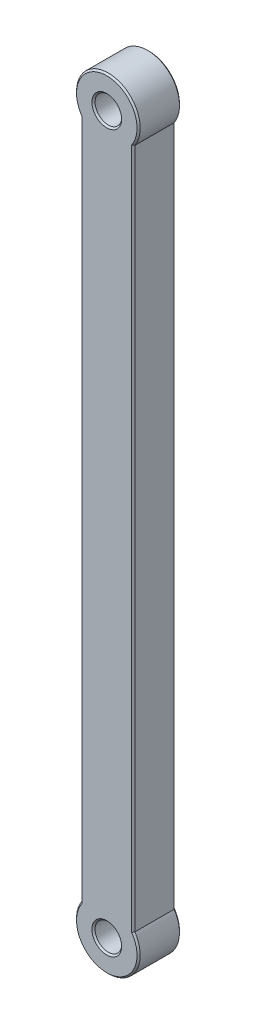
ISO-10303-21;
HEADER;
FILE_DESCRIPTION(('STEP AP214'),'2;1');
FILE_NAME('part.step','',(''),(''),'','','');
FILE_SCHEMA(('AUTOMOTIVE_DESIGN { 1 0 10303 214 1 1 1 1 }'));
ENDSEC;
DATA;
#1=APPLICATION_CONTEXT('core data for automotive mechanical design processes');
#2=APPLICATION_PROTOCOL_DEFINITION('international standard','automotive_design',2000,#1);
#3=PRODUCT_CONTEXT('',#1,'mechanical');
#4=PRODUCT('Part','Part','',(#3));
#5=PRODUCT_RELATED_PRODUCT_CATEGORY('part','',(#4));
#6=PRODUCT_DEFINITION_FORMATION('','',#4);
#7=PRODUCT_DEFINITION_CONTEXT('part definition',#1,'design');
#8=PRODUCT_DEFINITION('design','',#6,#7);
#9=PRODUCT_DEFINITION_SHAPE('','',#8);
#10=(LENGTH_UNIT() NAMED_UNIT(*) SI_UNIT(.MILLI.,.METRE.));
#11=(NAMED_UNIT(*) PLANE_ANGLE_UNIT() SI_UNIT($,.RADIAN.));
#12=(NAMED_UNIT(*) SI_UNIT($,.STERADIAN.) SOLID_ANGLE_UNIT());
#13=UNCERTAINTY_MEASURE_WITH_UNIT(LENGTH_MEASURE(1.E-05),#10,'distance_accuracy_value','');
#14=(GEOMETRIC_REPRESENTATION_CONTEXT(3) GLOBAL_UNCERTAINTY_ASSIGNED_CONTEXT((#13)) GLOBAL_UNIT_ASSIGNED_CONTEXT((#10,
#11,#12)) REPRESENTATION_CONTEXT('',''));
#15=CARTESIAN_POINT('',(0.,0.,0.));
#16=DIRECTION('',(0.,0.,1.));
#17=DIRECTION('',(1.,0.,0.));
#18=AXIS2_PLACEMENT_3D('',#15,#16,#17);
#19=CARTESIAN_POINT('',(5.,0.,8.));
#20=DIRECTION('',(-1.,0.,0.));
#21=DIRECTION('',(0.,0.,1.));
#22=AXIS2_PLACEMENT_3D('',#19,#20,#21);
#23=PLANE('',#22);
#24=DIRECTION('',(0.,0.,-1.));
#25=VECTOR('',#24,1.);
#26=CARTESIAN_POINT('',(5.,3.3166247903554,24.9705627484771));
#27=LINE('',#26,#25);
#28=CARTESIAN_POINT('',(5.,3.3166247903554,0.299999999999995));
#29=VERTEX_POINT('',#28);
#30=CARTESIAN_POINT('',(5.,3.3166247903554,7.69999999999999));
#31=VERTEX_POINT('',#30);
#32=EDGE_CURVE('E487',#29,#31,#27,.F.);
#33=ORIENTED_EDGE('',*,*,#32,.F.);
#34=DIRECTION('',(0.,1.,0.));
#35=VECTOR('',#34,1.);
#36=CARTESIAN_POINT('',(5.,0.,0.299999999999995));
#37=LINE('',#36,#35);
#38=CARTESIAN_POINT('',(5.,131.683375209645,0.299999999999995));
#39=VERTEX_POINT('',#38);
#40=EDGE_CURVE('E140',#29,#39,#37,.T.);
#41=ORIENTED_EDGE('',*,*,#40,.T.);
#42=DIRECTION('',(0.,0.,-1.));
#43=VECTOR('',#42,1.);
#44=CARTESIAN_POINT('',(5.,131.683375209645,24.9705627484771));
#45=LINE('',#44,#43);
#46=CARTESIAN_POINT('',(5.,131.683375209645,7.69999999999999));
#47=VERTEX_POINT('',#46);
#48=EDGE_CURVE('E124',#47,#39,#45,.T.);
#49=ORIENTED_EDGE('',*,*,#48,.F.);
#50=DIRECTION('',(0.,-1.,0.));
#51=VECTOR('',#50,1.);
#52=CARTESIAN_POINT('',(5.,3.3166247903554,7.69999999999998));
#53=LINE('',#52,#51);
#54=EDGE_CURVE('E137',#47,#31,#53,.T.);
#55=ORIENTED_EDGE('',*,*,#54,.T.);
#56=EDGE_LOOP('',(#33,#41,#49,#55));
#57=FACE_BOUND('',#56,.T.);
#58=ADVANCED_FACE('F46',(#57),#23,.F.);
#59=CARTESIAN_POINT('',(-5.,0.,8.));
#60=DIRECTION('',(1.,0.,0.));
#61=DIRECTION('',(0.,0.,-1.));
#62=AXIS2_PLACEMENT_3D('',#59,#60,#61);
#63=PLANE('',#62);
#64=DIRECTION('',(0.,0.,-1.));
#65=VECTOR('',#64,1.);
#66=CARTESIAN_POINT('',(-5.,131.683375209645,24.9705627484771));
#67=LINE('',#66,#65);
#68=CARTESIAN_POINT('',(-5.,131.683375209645,0.299999999999995));
#69=VERTEX_POINT('',#68);
#70=CARTESIAN_POINT('',(-5.,131.683375209645,7.69999999999999));
#71=VERTEX_POINT('',#70);
#72=EDGE_CURVE('E127',#69,#71,#67,.F.);
#73=ORIENTED_EDGE('',*,*,#72,.F.);
#74=DIRECTION('',(0.,-1.,0.));
#75=VECTOR('',#74,1.);
#76=CARTESIAN_POINT('',(-5.,0.,0.299999999999995));
#77=LINE('',#76,#75);
#78=CARTESIAN_POINT('',(-5.,3.3166247903554,0.299999999999995));
#79=VERTEX_POINT('',#78);
#80=EDGE_CURVE('E323',#69,#79,#77,.T.);
#81=ORIENTED_EDGE('',*,*,#80,.T.);
#82=DIRECTION('',(0.,0.,-1.));
#83=VECTOR('',#82,1.);
#84=CARTESIAN_POINT('',(-5.,3.3166247903554,24.9705627484771));
#85=LINE('',#84,#83);
#86=CARTESIAN_POINT('',(-5.,3.3166247903554,7.69999999999999));
#87=VERTEX_POINT('',#86);
#88=EDGE_CURVE('E207',#87,#79,#85,.T.);
#89=ORIENTED_EDGE('',*,*,#88,.F.);
#90=DIRECTION('',(0.,1.,0.));
#91=VECTOR('',#90,1.);
#92=CARTESIAN_POINT('',(-5.,131.683375209645,7.69999999999998));
#93=LINE('',#92,#91);
#94=EDGE_CURVE('E320',#87,#71,#93,.T.);
#95=ORIENTED_EDGE('',*,*,#94,.T.);
#96=EDGE_LOOP('',(#73,#81,#89,#95));
#97=FACE_BOUND('',#96,.T.);
#98=ADVANCED_FACE('F253',(#97),#63,.F.);
#99=CARTESIAN_POINT('',(0.,0.,8.));
#100=DIRECTION('',(0.,0.,1.));
#101=DIRECTION('',(1.,0.,0.));
#102=AXIS2_PLACEMENT_3D('',#99,#100,#101);
#103=PLANE('',#102);
#104=CARTESIAN_POINT('',(0.,135.,8.));
#105=DIRECTION('',(0.,0.,1.));
#106=DIRECTION('',(1.,0.,0.));
#107=AXIS2_PLACEMENT_3D('',#104,#105,#106);
#108=CIRCLE('',#107,5.70000000000001);
#109=CARTESIAN_POINT('',(4.7,131.775096900681,8.));
#110=VERTEX_POINT('',#109);
#111=CARTESIAN_POINT('',(-4.69999999999999,131.775096900681,8.));
#112=VERTEX_POINT('',#111);
#113=EDGE_CURVE('E63',#110,#112,#108,.T.);
#114=ORIENTED_EDGE('',*,*,#113,.T.);
#115=DIRECTION('',(0.,-1.,0.));
#116=VECTOR('',#115,1.);
#117=CARTESIAN_POINT('',(-4.7,3.3166247903554,8.));
#118=LINE('',#117,#116);
#119=CARTESIAN_POINT('',(-4.69999999999999,3.22490309931942,8.));
#120=VERTEX_POINT('',#119);
#121=EDGE_CURVE('E11',#112,#120,#118,.T.);
#122=ORIENTED_EDGE('',*,*,#121,.T.);
#123=CARTESIAN_POINT('',(0.,0.,8.));
#124=DIRECTION('',(0.,0.,1.));
#125=DIRECTION('',(1.,0.,0.));
#126=AXIS2_PLACEMENT_3D('',#123,#124,#125);
#127=CIRCLE('',#126,5.7);
#128=CARTESIAN_POINT('',(4.69999999999999,3.22490309931942,8.));
#129=VERTEX_POINT('',#128);
#130=EDGE_CURVE('E308',#120,#129,#127,.T.);
#131=ORIENTED_EDGE('',*,*,#130,.T.);
#132=DIRECTION('',(0.,1.,0.));
#133=VECTOR('',#132,1.);
#134=CARTESIAN_POINT('',(4.7,131.683375209645,8.));
#135=LINE('',#134,#133);
#136=EDGE_CURVE('E74',#129,#110,#135,.T.);
#137=ORIENTED_EDGE('',*,*,#136,.T.);
#138=EDGE_LOOP('',(#114,#122,#131,#137));
#139=FACE_BOUND('',#138,.T.);
#140=CARTESIAN_POINT('',(0.,0.,8.));
#141=DIRECTION('',(0.,0.,1.));
#142=DIRECTION('',(1.,0.,0.));
#143=AXIS2_PLACEMENT_3D('',#140,#141,#142);
#144=CIRCLE('',#143,2.79999999999998);
#145=CARTESIAN_POINT('',(2.79999999999998,0.,8.));
#146=VERTEX_POINT('',#145);
#147=EDGE_CURVE('E304',#146,#146,#144,.F.);
#148=ORIENTED_EDGE('',*,*,#147,.T.);
#149=EDGE_LOOP('',(#148));
#150=FACE_BOUND('',#149,.T.);
#151=CARTESIAN_POINT('',(-6.24500451351651E-13,135.000000000001,8.));
#152=DIRECTION('',(0.,0.,1.));
#153=DIRECTION('',(1.,0.,0.));
#154=AXIS2_PLACEMENT_3D('',#151,#152,#153);
#155=CIRCLE('',#154,2.80000000000001);
#156=CARTESIAN_POINT('',(2.79999999999939,135.000000000001,8.));
#157=VERTEX_POINT('',#156);
#158=EDGE_CURVE('E294',#157,#157,#155,.F.);
#159=ORIENTED_EDGE('',*,*,#158,.T.);
#160=EDGE_LOOP('',(#159));
#161=FACE_BOUND('',#160,.T.);
#162=ADVANCED_FACE('F256',(#139,#150,#161),#103,.T.);
#163=CARTESIAN_POINT('',(0.,0.,0.));
#164=DIRECTION('',(0.,0.,1.));
#165=DIRECTION('',(1.,0.,0.));
#166=AXIS2_PLACEMENT_3D('',#163,#164,#165);
#167=PLANE('',#166);
#168=DIRECTION('',(0.,1.,0.));
#169=VECTOR('',#168,1.);
#170=CARTESIAN_POINT('',(-4.70000000000001,0.,0.));
#171=LINE('',#170,#169);
#172=CARTESIAN_POINT('',(-4.7,3.22490309931942,0.));
#173=VERTEX_POINT('',#172);
#174=CARTESIAN_POINT('',(-4.70000000000001,131.775096900681,0.));
#175=VERTEX_POINT('',#174);
#176=EDGE_CURVE('E330',#173,#175,#171,.T.);
#177=ORIENTED_EDGE('',*,*,#176,.T.);
#178=CARTESIAN_POINT('',(0.,135.,0.));
#179=DIRECTION('',(0.,0.,1.));
#180=DIRECTION('',(1.,0.,0.));
#181=AXIS2_PLACEMENT_3D('',#178,#179,#180);
#182=CIRCLE('',#181,5.70000000000001);
#183=CARTESIAN_POINT('',(4.70000000000001,131.775096900681,0.));
#184=VERTEX_POINT('',#183);
#185=EDGE_CURVE('E324',#175,#184,#182,.F.);
#186=ORIENTED_EDGE('',*,*,#185,.T.);
#187=DIRECTION('',(0.,-1.,0.));
#188=VECTOR('',#187,1.);
#189=CARTESIAN_POINT('',(4.70000000000001,0.,0.));
#190=LINE('',#189,#188);
#191=CARTESIAN_POINT('',(4.70000000000001,3.22490309931942,0.));
#192=VERTEX_POINT('',#191);
#193=EDGE_CURVE('E502',#184,#192,#190,.T.);
#194=ORIENTED_EDGE('',*,*,#193,.T.);
#195=CARTESIAN_POINT('',(0.,0.,0.));
#196=DIRECTION('',(0.,0.,1.));
#197=DIRECTION('',(1.,0.,0.));
#198=AXIS2_PLACEMENT_3D('',#195,#196,#197);
#199=CIRCLE('',#198,5.70000000000001);
#200=EDGE_CURVE('E505',#192,#173,#199,.F.);
#201=ORIENTED_EDGE('',*,*,#200,.T.);
#202=EDGE_LOOP('',(#177,#186,#194,#201));
#203=FACE_BOUND('',#202,.T.);
#204=CARTESIAN_POINT('',(0.,0.,0.));
#205=DIRECTION('',(0.,0.,1.));
#206=DIRECTION('',(1.,0.,0.));
#207=AXIS2_PLACEMENT_3D('',#204,#205,#206);
#208=CIRCLE('',#207,2.80000000000001);
#209=CARTESIAN_POINT('',(2.80000000000001,0.,0.));
#210=VERTEX_POINT('',#209);
#211=EDGE_CURVE('E498',#210,#210,#208,.T.);
#212=ORIENTED_EDGE('',*,*,#211,.T.);
#213=EDGE_LOOP('',(#212));
#214=FACE_BOUND('',#213,.T.);
#215=CARTESIAN_POINT('',(-6.24500451351651E-13,135.000000000001,0.));
#216=DIRECTION('',(0.,0.,1.));
#217=DIRECTION('',(1.,0.,0.));
#218=AXIS2_PLACEMENT_3D('',#215,#216,#217);
#219=CIRCLE('',#218,2.80000000000004);
#220=CARTESIAN_POINT('',(2.79999999999941,135.000000000001,0.));
#221=VERTEX_POINT('',#220);
#222=EDGE_CURVE('E494',#221,#221,#219,.T.);
#223=ORIENTED_EDGE('',*,*,#222,.T.);
#224=EDGE_LOOP('',(#223));
#225=FACE_BOUND('',#224,.T.);
#226=ADVANCED_FACE('F258',(#203,#214,#225),#167,.F.);
#227=CARTESIAN_POINT('',(0.,135.,24.9705627484771));
#228=DIRECTION('',(0.,0.,-1.));
#229=DIRECTION('',(-1.,0.,0.));
#230=AXIS2_PLACEMENT_3D('',#227,#228,#229);
#231=CYLINDRICAL_SURFACE('',#230,6.);
#232=ORIENTED_EDGE('',*,*,#48,.T.);
#233=CARTESIAN_POINT('',(0.,135.,0.299999999999995));
#234=DIRECTION('',(0.,0.,1.));
#235=DIRECTION('',(1.,0.,0.));
#236=AXIS2_PLACEMENT_3D('',#233,#234,#235);
#237=CIRCLE('',#236,6.);
#238=EDGE_CURVE('E132',#39,#69,#237,.T.);
#239=ORIENTED_EDGE('',*,*,#238,.T.);
#240=ORIENTED_EDGE('',*,*,#72,.T.);
#241=CARTESIAN_POINT('',(0.,135.,7.69999999999999));
#242=DIRECTION('',(0.,0.,1.));
#243=DIRECTION('',(1.,0.,0.));
#244=AXIS2_PLACEMENT_3D('',#241,#242,#243);
#245=CIRCLE('',#244,6.);
#246=EDGE_CURVE('E120',#71,#47,#245,.F.);
#247=ORIENTED_EDGE('',*,*,#246,.T.);
#248=EDGE_LOOP('',(#232,#239,#240,#247));
#249=FACE_BOUND('',#248,.T.);
#250=ADVANCED_FACE('F122',(#249),#231,.T.);
#251=CARTESIAN_POINT('',(0.,0.,24.9705627484771));
#252=DIRECTION('',(0.,0.,-1.));
#253=DIRECTION('',(-1.,0.,0.));
#254=AXIS2_PLACEMENT_3D('',#251,#252,#253);
#255=CYLINDRICAL_SURFACE('',#254,6.);
#256=ORIENTED_EDGE('',*,*,#88,.T.);
#257=CARTESIAN_POINT('',(0.,0.,0.299999999999995));
#258=DIRECTION('',(0.,0.,1.));
#259=DIRECTION('',(1.,0.,0.));
#260=AXIS2_PLACEMENT_3D('',#257,#258,#259);
#261=CIRCLE('',#260,6.);
#262=EDGE_CURVE('E150',#79,#29,#261,.T.);
#263=ORIENTED_EDGE('',*,*,#262,.T.);
#264=ORIENTED_EDGE('',*,*,#32,.T.);
#265=CARTESIAN_POINT('',(0.,0.,7.69999999999999));
#266=DIRECTION('',(0.,0.,1.));
#267=DIRECTION('',(1.,0.,0.));
#268=AXIS2_PLACEMENT_3D('',#265,#266,#267);
#269=CIRCLE('',#268,6.);
#270=EDGE_CURVE('E317',#31,#87,#269,.F.);
#271=ORIENTED_EDGE('',*,*,#270,.T.);
#272=EDGE_LOOP('',(#256,#263,#264,#271));
#273=FACE_BOUND('',#272,.T.);
#274=ADVANCED_FACE('F266',(#273),#255,.T.);
#275=CARTESIAN_POINT('',(0.,0.,8.));
#276=DIRECTION('',(0.,0.,-1.));
#277=DIRECTION('',(-1.,0.,0.));
#278=AXIS2_PLACEMENT_3D('',#275,#276,#277);
#279=CYLINDRICAL_SURFACE('',#278,2.5);
#280=CARTESIAN_POINT('',(0.,0.,0.300000000000019));
#281=DIRECTION('',(0.,0.,1.));
#282=DIRECTION('',(1.,0.,0.));
#283=AXIS2_PLACEMENT_3D('',#280,#281,#282);
#284=CIRCLE('',#283,2.5);
#285=CARTESIAN_POINT('',(2.5,0.,0.300000000000019));
#286=VERTEX_POINT('',#285);
#287=EDGE_CURVE('E290',#286,#286,#284,.F.);
#288=ORIENTED_EDGE('',*,*,#287,.T.);
#289=EDGE_LOOP('',(#288));
#290=FACE_BOUND('',#289,.T.);
#291=CARTESIAN_POINT('',(0.,0.,7.70000000000001));
#292=DIRECTION('',(0.,0.,1.));
#293=DIRECTION('',(1.,0.,0.));
#294=AXIS2_PLACEMENT_3D('',#291,#292,#293);
#295=CIRCLE('',#294,2.5);
#296=CARTESIAN_POINT('',(2.5,0.,7.70000000000001));
#297=VERTEX_POINT('',#296);
#298=EDGE_CURVE('E297',#297,#297,#295,.T.);
#299=ORIENTED_EDGE('',*,*,#298,.T.);
#300=EDGE_LOOP('',(#299));
#301=FACE_BOUND('',#300,.T.);
#302=ADVANCED_FACE('F269',(#290,#301),#279,.F.);
#303=CARTESIAN_POINT('',(-6.24500451351651E-13,135.000000000001,8.));
#304=DIRECTION('',(0.,0.,-1.));
#305=DIRECTION('',(-1.,0.,0.));
#306=AXIS2_PLACEMENT_3D('',#303,#304,#305);
#307=CYLINDRICAL_SURFACE('',#306,2.5);
#308=CARTESIAN_POINT('',(-6.24500451351651E-13,135.000000000001,0.300000000000033));
#309=DIRECTION('',(0.,0.,1.));
#310=DIRECTION('',(1.,0.,0.));
#311=AXIS2_PLACEMENT_3D('',#308,#309,#310);
#312=CIRCLE('',#311,2.5);
#313=CARTESIAN_POINT('',(2.49999999999938,135.000000000001,0.300000000000033));
#314=VERTEX_POINT('',#313);
#315=EDGE_CURVE('E284',#314,#314,#312,.F.);
#316=ORIENTED_EDGE('',*,*,#315,.T.);
#317=EDGE_LOOP('',(#316));
#318=FACE_BOUND('',#317,.T.);
#319=CARTESIAN_POINT('',(-6.24500451351651E-13,135.000000000001,7.69999999999998));
#320=DIRECTION('',(0.,0.,1.));
#321=DIRECTION('',(1.,0.,0.));
#322=AXIS2_PLACEMENT_3D('',#319,#320,#321);
#323=CIRCLE('',#322,2.5);
#324=CARTESIAN_POINT('',(2.49999999999938,135.000000000001,7.69999999999998));
#325=VERTEX_POINT('',#324);
#326=EDGE_CURVE('E287',#325,#325,#323,.T.);
#327=ORIENTED_EDGE('',*,*,#326,.T.);
#328=EDGE_LOOP('',(#327));
#329=FACE_BOUND('',#328,.T.);
#330=ADVANCED_FACE('F273',(#318,#329),#307,.F.);
#331=CARTESIAN_POINT('',(0.,0.,0.299999999999995));
#332=DIRECTION('',(0.,0.,1.));
#333=DIRECTION('',(1.,0.,0.));
#334=AXIS2_PLACEMENT_3D('',#331,#332,#333);
#335=CONICAL_SURFACE('',#334,6.,0.785398163397448);
#336=CARTESIAN_POINT('',(-5.,3.3166247903554,0.299999999999995));
#337=CARTESIAN_POINT('',(-4.94996870034109,3.30154260784642,0.249968700341084));
#338=CARTESIAN_POINT('',(-4.89995305185478,3.28635804275535,0.199953051854772));
#339=CARTESIAN_POINT('',(-4.79995305185142,3.25578414576538,0.0999530518514084));
#340=CARTESIAN_POINT('',(-4.74996870033773,3.24039481384446,0.0499687003377222));
#341=CARTESIAN_POINT('',(-4.70000000000001,3.22490309931943,0.));
#342=B_SPLINE_CURVE_WITH_KNOTS('',3,(#336,#337,#338,#339,#340,#341),.UNSPECIFIED.,.F.,.F.,(4,2,
4),(0.,0.217032971771939,0.43406596687899),.UNSPECIFIED.);
#343=EDGE_CURVE('E208',#173,#79,#342,.F.);
#344=ORIENTED_EDGE('',*,*,#343,.F.);
#345=ORIENTED_EDGE('',*,*,#200,.F.);
#346=CARTESIAN_POINT('',(5.,3.3166247903554,0.299999999999995));
#347=CARTESIAN_POINT('',(4.94996870034109,3.30154260784642,0.249968700341084));
#348=CARTESIAN_POINT('',(4.89995305185478,3.28635804275535,0.199953051854772));
#349=CARTESIAN_POINT('',(4.79995305185142,3.25578414576538,0.0999530518514081));
#350=CARTESIAN_POINT('',(4.74996870033773,3.24039481384446,0.0499687003377215));
#351=CARTESIAN_POINT('',(4.70000000000001,3.22490309931943,0.));
#352=B_SPLINE_CURVE_WITH_KNOTS('',3,(#346,#347,#348,#349,#350,#351),.UNSPECIFIED.,.F.,.F.,(4,2,
4),(0.,0.217032971771939,0.434065966878991),.UNSPECIFIED.);
#353=EDGE_CURVE('E197',#29,#192,#352,.T.);
#354=ORIENTED_EDGE('',*,*,#353,.F.);
#355=ORIENTED_EDGE('',*,*,#262,.F.);
#356=EDGE_LOOP('',(#344,#345,#354,#355));
#357=FACE_BOUND('',#356,.T.);
#358=ADVANCED_FACE('F216',(#357),#335,.T.);
#359=CARTESIAN_POINT('',(5.,0.,0.299999999999995));
#360=DIRECTION('',(-0.707106781186547,0.,0.707106781186547));
#361=DIRECTION('',(0.,1.,0.));
#362=AXIS2_PLACEMENT_3D('',#359,#360,#361);
#363=PLANE('',#362);
#364=ORIENTED_EDGE('',*,*,#353,.T.);
#365=ORIENTED_EDGE('',*,*,#193,.F.);
#366=CARTESIAN_POINT('',(4.70000000000001,131.775096900681,0.));
#367=CARTESIAN_POINT('',(4.74996870033773,131.759605186156,0.0499687003377223));
#368=CARTESIAN_POINT('',(4.79995305185142,131.744215854235,0.0999530518514081));
#369=CARTESIAN_POINT('',(4.89995305185478,131.713641957245,0.199953051854772));
#370=CARTESIAN_POINT('',(4.94996870034109,131.698457392154,0.249968700341084));
#371=CARTESIAN_POINT('',(5.,131.683375209645,0.299999999999994));
#372=B_SPLINE_CURVE_WITH_KNOTS('',3,(#366,#367,#368,#369,#370,#371),.UNSPECIFIED.,.F.,.F.,(4,2,
4),(0.,0.217032995107047,0.434065966878989),.UNSPECIFIED.);
#373=EDGE_CURVE('E157',#39,#184,#372,.F.);
#374=ORIENTED_EDGE('',*,*,#373,.F.);
#375=ORIENTED_EDGE('',*,*,#40,.F.);
#376=EDGE_LOOP('',(#364,#365,#374,#375));
#377=FACE_BOUND('',#376,.T.);
#378=ADVANCED_FACE('F220',(#377),#363,.F.);
#379=CARTESIAN_POINT('',(-5.,0.,0.299999999999995));
#380=DIRECTION('',(0.707106781186547,0.,0.707106781186547));
#381=DIRECTION('',(0.,-1.,0.));
#382=AXIS2_PLACEMENT_3D('',#379,#380,#381);
#383=PLANE('',#382);
#384=ORIENTED_EDGE('',*,*,#343,.T.);
#385=ORIENTED_EDGE('',*,*,#80,.F.);
#386=CARTESIAN_POINT('',(-5.,131.683375209645,0.299999999999995));
#387=CARTESIAN_POINT('',(-4.94996870034109,131.698457392154,0.249968700341085));
#388=CARTESIAN_POINT('',(-4.89995305185478,131.713641957245,0.199953051854774));
#389=CARTESIAN_POINT('',(-4.79995305185142,131.744215854235,0.0999530518514095));
#390=CARTESIAN_POINT('',(-4.74996870033773,131.759605186156,0.0499687003377222));
#391=CARTESIAN_POINT('',(-4.7,131.775096900681,0.));
#392=B_SPLINE_CURVE_WITH_KNOTS('',3,(#386,#387,#388,#389,#390,#391),.UNSPECIFIED.,.F.,.F.,(4,2,
4),(0.,0.21703297177194,0.434065966878991),.UNSPECIFIED.);
#393=EDGE_CURVE('E154',#175,#69,#392,.F.);
#394=ORIENTED_EDGE('',*,*,#393,.F.);
#395=ORIENTED_EDGE('',*,*,#176,.F.);
#396=EDGE_LOOP('',(#384,#385,#394,#395));
#397=FACE_BOUND('',#396,.T.);
#398=ADVANCED_FACE('F226',(#397),#383,.F.);
#399=CARTESIAN_POINT('',(0.,135.,0.299999999999995));
#400=DIRECTION('',(0.,0.,1.));
#401=DIRECTION('',(1.,0.,0.));
#402=AXIS2_PLACEMENT_3D('',#399,#400,#401);
#403=CONICAL_SURFACE('',#402,6.,0.785398163397443);
#404=ORIENTED_EDGE('',*,*,#373,.T.);
#405=ORIENTED_EDGE('',*,*,#185,.F.);
#406=ORIENTED_EDGE('',*,*,#393,.T.);
#407=ORIENTED_EDGE('',*,*,#238,.F.);
#408=EDGE_LOOP('',(#404,#405,#406,#407));
#409=FACE_BOUND('',#408,.T.);
#410=ADVANCED_FACE('F241',(#409),#403,.T.);
#411=CARTESIAN_POINT('',(0.,0.,0.300000000000019));
#412=DIRECTION('',(0.,0.,-1.));
#413=DIRECTION('',(-1.,0.,0.));
#414=AXIS2_PLACEMENT_3D('',#411,#412,#413);
#415=CONICAL_SURFACE('',#414,2.5,0.785398163397434);
#416=ORIENTED_EDGE('',*,*,#211,.F.);
#417=EDGE_LOOP('',(#416));
#418=FACE_BOUND('',#417,.T.);
#419=ORIENTED_EDGE('',*,*,#287,.F.);
#420=EDGE_LOOP('',(#419));
#421=FACE_BOUND('',#420,.T.);
#422=ADVANCED_FACE('F248',(#418,#421),#415,.F.);
#423=CARTESIAN_POINT('',(-6.24500451351651E-13,135.000000000001,0.300000000000033));
#424=DIRECTION('',(0.,0.,-1.));
#425=DIRECTION('',(-1.,0.,0.));
#426=AXIS2_PLACEMENT_3D('',#423,#424,#425);
#427=CONICAL_SURFACE('',#426,2.5,0.785398163397456);
#428=ORIENTED_EDGE('',*,*,#222,.F.);
#429=EDGE_LOOP('',(#428));
#430=FACE_BOUND('',#429,.T.);
#431=ORIENTED_EDGE('',*,*,#315,.F.);
#432=EDGE_LOOP('',(#431));
#433=FACE_BOUND('',#432,.T.);
#434=ADVANCED_FACE('F383',(#430,#433),#427,.F.);
#435=CARTESIAN_POINT('',(4.7,0.,8.));
#436=DIRECTION('',(0.707106781186563,0.,0.707106781186532));
#437=DIRECTION('',(0.,-1.,0.));
#438=AXIS2_PLACEMENT_3D('',#435,#436,#437);
#439=PLANE('',#438);
#440=CARTESIAN_POINT('',(5.,3.3166247903554,7.69999999999999));
#441=CARTESIAN_POINT('',(4.94996870034109,3.30154260784643,7.7500312996589));
#442=CARTESIAN_POINT('',(4.89995305185477,3.28635804275535,7.80004694814521));
#443=CARTESIAN_POINT('',(4.79995305185141,3.25578414576538,7.90004694814859));
#444=CARTESIAN_POINT('',(4.74996870033772,3.24039481384446,7.95003129966227));
#445=CARTESIAN_POINT('',(4.7,3.22490309931942,8.));
#446=B_SPLINE_CURVE_WITH_KNOTS('',3,(#440,#441,#442,#443,#444,#445),.UNSPECIFIED.,.F.,.F.,(4,2,
4),(0.,0.21703297177195,0.434065966879011),.UNSPECIFIED.);
#447=EDGE_CURVE('E147',#31,#129,#446,.T.);
#448=ORIENTED_EDGE('',*,*,#447,.F.);
#449=ORIENTED_EDGE('',*,*,#54,.F.);
#450=CARTESIAN_POINT('',(5.,131.683375209645,7.69999999999999));
#451=CARTESIAN_POINT('',(4.94996870034109,131.698457392154,7.7500312996589));
#452=CARTESIAN_POINT('',(4.89995305185478,131.713641957245,7.80004694814521));
#453=CARTESIAN_POINT('',(4.79995305185141,131.744215854235,7.90004694814858));
#454=CARTESIAN_POINT('',(4.74996870033772,131.759605186156,7.95003129966228));
#455=CARTESIAN_POINT('',(4.69999999999999,131.775096900681,8.));
#456=B_SPLINE_CURVE_WITH_KNOTS('',3,(#450,#451,#452,#453,#454,#455),.UNSPECIFIED.,.F.,.F.,(4,2,
4),(0.,0.217032971771941,0.434065966879012),.UNSPECIFIED.);
#457=EDGE_CURVE('E51',#110,#47,#456,.F.);
#458=ORIENTED_EDGE('',*,*,#457,.F.);
#459=ORIENTED_EDGE('',*,*,#136,.F.);
#460=EDGE_LOOP('',(#448,#449,#458,#459));
#461=FACE_BOUND('',#460,.T.);
#462=ADVANCED_FACE('F145',(#461),#439,.T.);
#463=CARTESIAN_POINT('',(0.,135.,8.));
#464=DIRECTION('',(0.,0.,-1.));
#465=DIRECTION('',(-1.,0.,0.));
#466=AXIS2_PLACEMENT_3D('',#463,#464,#465);
#467=CONICAL_SURFACE('',#466,5.70000000000001,0.785398163397408);
#468=ORIENTED_EDGE('',*,*,#457,.T.);
#469=ORIENTED_EDGE('',*,*,#246,.F.);
#470=CARTESIAN_POINT('',(-5.,131.683375209645,7.69999999999999));
#471=CARTESIAN_POINT('',(-4.94996870034109,131.698457392154,7.7500312996589));
#472=CARTESIAN_POINT('',(-4.89995305185478,131.713641957245,7.80004694814521));
#473=CARTESIAN_POINT('',(-4.79995305185141,131.744215854235,7.90004694814858));
#474=CARTESIAN_POINT('',(-4.74996870033772,131.759605186156,7.95003129966228));
#475=CARTESIAN_POINT('',(-4.69999999999999,131.775096900681,8.));
#476=B_SPLINE_CURVE_WITH_KNOTS('',3,(#470,#471,#472,#473,#474,#475),.UNSPECIFIED.,.F.,.F.,(4,2,
4),(0.,0.217032971771941,0.434065966879012),.UNSPECIFIED.);
#477=EDGE_CURVE('E159',#112,#71,#476,.F.);
#478=ORIENTED_EDGE('',*,*,#477,.F.);
#479=ORIENTED_EDGE('',*,*,#113,.F.);
#480=EDGE_LOOP('',(#468,#469,#478,#479));
#481=FACE_BOUND('',#480,.T.);
#482=ADVANCED_FACE('F152',(#481),#467,.T.);
#483=CARTESIAN_POINT('',(0.,0.,8.));
#484=DIRECTION('',(0.,0.,-1.));
#485=DIRECTION('',(-1.,0.,0.));
#486=AXIS2_PLACEMENT_3D('',#483,#484,#485);
#487=CONICAL_SURFACE('',#486,5.7,0.78539816339743);
#488=ORIENTED_EDGE('',*,*,#447,.T.);
#489=ORIENTED_EDGE('',*,*,#130,.F.);
#490=CARTESIAN_POINT('',(-4.7,3.22490309931942,8.));
#491=CARTESIAN_POINT('',(-4.74996870033772,3.24039481384445,7.95003129966227));
#492=CARTESIAN_POINT('',(-4.79995305185141,3.25578414576537,7.90004694814859));
#493=CARTESIAN_POINT('',(-4.89995305185477,3.28635804275535,7.80004694814521));
#494=CARTESIAN_POINT('',(-4.94996870034109,3.30154260784643,7.7500312996589));
#495=CARTESIAN_POINT('',(-5.,3.31662479035541,7.69999999999999));
#496=B_SPLINE_CURVE_WITH_KNOTS('',3,(#490,#491,#492,#493,#494,#495),.UNSPECIFIED.,.F.,.F.,(4,2,
4),(0.,0.217032995107061,0.43406596687901),.UNSPECIFIED.);
#497=EDGE_CURVE('E163',#87,#120,#496,.F.);
#498=ORIENTED_EDGE('',*,*,#497,.F.);
#499=ORIENTED_EDGE('',*,*,#270,.F.);
#500=EDGE_LOOP('',(#488,#489,#498,#499));
#501=FACE_BOUND('',#500,.T.);
#502=ADVANCED_FACE('F179',(#501),#487,.T.);
#503=CARTESIAN_POINT('',(-4.7,0.,8.));
#504=DIRECTION('',(-0.707106781186563,0.,0.707106781186532));
#505=DIRECTION('',(0.,1.,0.));
#506=AXIS2_PLACEMENT_3D('',#503,#504,#505);
#507=PLANE('',#506);
#508=ORIENTED_EDGE('',*,*,#477,.T.);
#509=ORIENTED_EDGE('',*,*,#94,.F.);
#510=ORIENTED_EDGE('',*,*,#497,.T.);
#511=ORIENTED_EDGE('',*,*,#121,.F.);
#512=EDGE_LOOP('',(#508,#509,#510,#511));
#513=FACE_BOUND('',#512,.T.);
#514=ADVANCED_FACE('F186',(#513),#507,.T.);
#515=CARTESIAN_POINT('',(0.,0.,8.));
#516=DIRECTION('',(0.,0.,1.));
#517=DIRECTION('',(1.,0.,0.));
#518=AXIS2_PLACEMENT_3D('',#515,#516,#517);
#519=CONICAL_SURFACE('',#518,2.79999999999998,0.785398163397434);
#520=ORIENTED_EDGE('',*,*,#298,.F.);
#521=EDGE_LOOP('',(#520));
#522=FACE_BOUND('',#521,.T.);
#523=ORIENTED_EDGE('',*,*,#147,.F.);
#524=EDGE_LOOP('',(#523));
#525=FACE_BOUND('',#524,.T.);
#526=ADVANCED_FACE('F344',(#522,#525),#519,.F.);
#527=CARTESIAN_POINT('',(-6.24500451351651E-13,135.000000000001,8.));
#528=DIRECTION('',(0.,0.,1.));
#529=DIRECTION('',(1.,0.,0.));
#530=AXIS2_PLACEMENT_3D('',#527,#528,#529);
#531=CONICAL_SURFACE('',#530,2.80000000000001,0.785398163397436);
#532=ORIENTED_EDGE('',*,*,#326,.F.);
#533=EDGE_LOOP('',(#532));
#534=FACE_BOUND('',#533,.T.);
#535=ORIENTED_EDGE('',*,*,#158,.F.);
#536=EDGE_LOOP('',(#535));
#537=FACE_BOUND('',#536,.T.);
#538=ADVANCED_FACE('F49',(#534,#537),#531,.F.);
#539=CLOSED_SHELL('',(#58,#98,#162,#226,#250,#274,#302,#330,#358,#378,#398,#410,#422,#434,#462,
#482,#502,#514,#526,#538));
#540=MANIFOLD_SOLID_BREP('B2',#539);
#541=ADVANCED_BREP_SHAPE_REPRESENTATION('',(#18,#540),#14);
#542=SHAPE_DEFINITION_REPRESENTATION(#9,#541);
ENDSEC;
END-ISO-10303-21;
